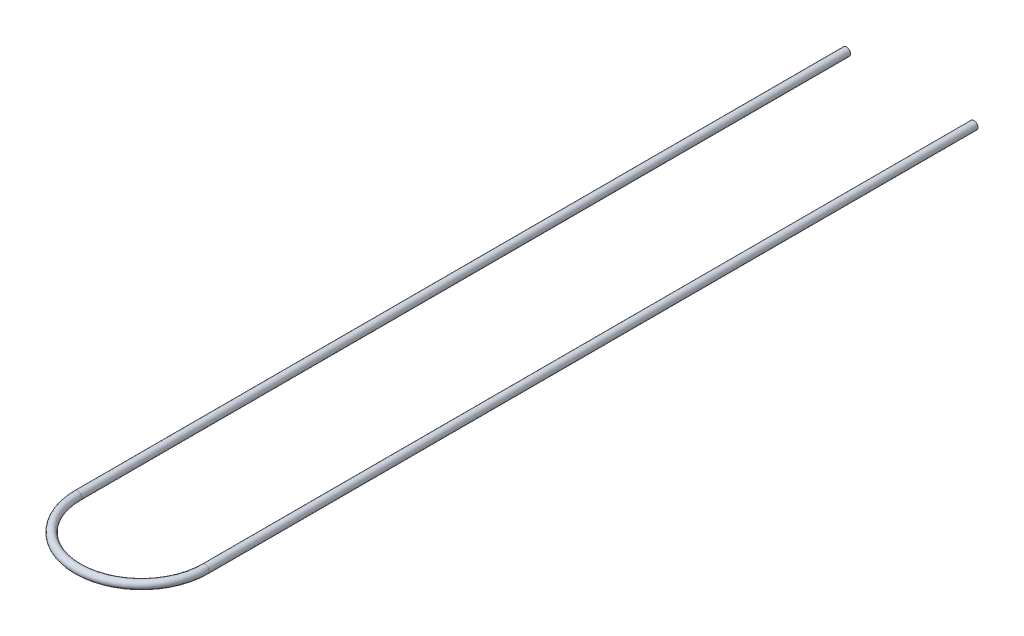
ISO-10303-21;
HEADER;
FILE_DESCRIPTION(('STEP AP214'),'2;1');
FILE_NAME('part.step','',(''),(''),'','','');
FILE_SCHEMA(('AUTOMOTIVE_DESIGN { 1 0 10303 214 1 1 1 1 }'));
ENDSEC;
DATA;
#1=APPLICATION_CONTEXT('core data for automotive mechanical design processes');
#2=APPLICATION_PROTOCOL_DEFINITION('international standard','automotive_design',2000,#1);
#3=PRODUCT_CONTEXT('',#1,'mechanical');
#4=PRODUCT('Part','Part','',(#3));
#5=PRODUCT_RELATED_PRODUCT_CATEGORY('part','',(#4));
#6=PRODUCT_DEFINITION_FORMATION('','',#4);
#7=PRODUCT_DEFINITION_CONTEXT('part definition',#1,'design');
#8=PRODUCT_DEFINITION('design','',#6,#7);
#9=PRODUCT_DEFINITION_SHAPE('','',#8);
#10=(LENGTH_UNIT() NAMED_UNIT(*) SI_UNIT(.MILLI.,.METRE.));
#11=(NAMED_UNIT(*) PLANE_ANGLE_UNIT() SI_UNIT($,.RADIAN.));
#12=(NAMED_UNIT(*) SI_UNIT($,.STERADIAN.) SOLID_ANGLE_UNIT());
#13=UNCERTAINTY_MEASURE_WITH_UNIT(LENGTH_MEASURE(1.E-05),#10,'distance_accuracy_value','');
#14=(GEOMETRIC_REPRESENTATION_CONTEXT(3) GLOBAL_UNCERTAINTY_ASSIGNED_CONTEXT((#13)) GLOBAL_UNIT_ASSIGNED_CONTEXT((#10,
#11,#12)) REPRESENTATION_CONTEXT('',''));
#15=CARTESIAN_POINT('',(0.,0.,0.));
#16=DIRECTION('',(0.,0.,1.));
#17=DIRECTION('',(1.,0.,0.));
#18=AXIS2_PLACEMENT_3D('',#15,#16,#17);
#19=CARTESIAN_POINT('',(-39.9999999999999,0.,299.999999999999));
#20=DIRECTION('',(0.,0.,1.));
#21=DIRECTION('',(1.,0.,0.));
#22=AXIS2_PLACEMENT_3D('',#19,#20,#21);
#23=CYLINDRICAL_SURFACE('',#22,11.1);
#24=CARTESIAN_POINT('',(-39.9999999999996,0.,2440.));
#25=DIRECTION('',(0.,0.,1.));
#26=DIRECTION('',(1.,0.,0.));
#27=AXIS2_PLACEMENT_3D('',#24,#25,#26);
#28=CIRCLE('',#27,11.1);
#29=CARTESIAN_POINT('',(-51.0999999999997,0.,2440.));
#30=VERTEX_POINT('',#29);
#31=EDGE_CURVE('E54',#30,#30,#28,.T.);
#32=ORIENTED_EDGE('',*,*,#31,.F.);
#33=EDGE_LOOP('',(#32));
#34=FACE_BOUND('',#33,.T.);
#35=CARTESIAN_POINT('',(-39.9999999999999,0.,299.999999999999));
#36=DIRECTION('',(0.,0.,1.));
#37=DIRECTION('',(1.,0.,0.));
#38=AXIS2_PLACEMENT_3D('',#35,#36,#37);
#39=CIRCLE('',#38,11.1);
#40=CARTESIAN_POINT('',(-28.8999999999999,0.,299.999999999999));
#41=VERTEX_POINT('',#40);
#42=EDGE_CURVE('E52',#41,#41,#39,.T.);
#43=ORIENTED_EDGE('',*,*,#42,.T.);
#44=EDGE_LOOP('',(#43));
#45=FACE_BOUND('',#44,.T.);
#46=ADVANCED_FACE('F31',(#34,#45),#23,.T.);
#47=CARTESIAN_POINT('',(137.385,0.,2440.));
#48=DIRECTION('',(0.,1.,0.));
#49=DIRECTION('',(0.,0.,1.));
#50=AXIS2_PLACEMENT_3D('',#47,#48,#49);
#51=TOROIDAL_SURFACE('',#50,177.385,11.1);
#52=CARTESIAN_POINT('',(314.77,0.,2440.));
#53=DIRECTION('',(0.,0.,-1.));
#54=DIRECTION('',(-1.,0.,0.));
#55=AXIS2_PLACEMENT_3D('',#52,#53,#54);
#56=CIRCLE('',#55,11.1);
#57=CARTESIAN_POINT('',(325.87,0.,2440.));
#58=VERTEX_POINT('',#57);
#59=EDGE_CURVE('E35',#58,#58,#56,.T.);
#60=CARTESIAN_POINT('',(137.385,0.,2440.));
#61=DIRECTION('',(0.,1.,0.));
#62=DIRECTION('',(0.,0.,1.));
#63=AXIS2_PLACEMENT_3D('',#60,#61,#62);
#64=CIRCLE('',#63,188.485);
#65=EDGE_CURVE('',#30,#58,#64,.T.);
#66=ORIENTED_EDGE('',*,*,#31,.T.);
#67=ORIENTED_EDGE('',*,*,#59,.F.);
#68=ORIENTED_EDGE('',*,*,#65,.T.);
#69=ORIENTED_EDGE('',*,*,#65,.F.);
#70=EDGE_LOOP('',(#66,#68,#67,#69));
#71=FACE_BOUND('',#70,.T.);
#72=ADVANCED_FACE('F62',(#71),#51,.T.);
#73=CARTESIAN_POINT('',(314.77,0.,2440.));
#74=DIRECTION('',(0.,0.,-1.));
#75=DIRECTION('',(-1.,0.,0.));
#76=AXIS2_PLACEMENT_3D('',#73,#74,#75);
#77=CYLINDRICAL_SURFACE('',#76,11.1);
#78=CARTESIAN_POINT('',(314.77,0.,299.999999999999));
#79=DIRECTION('',(0.,0.,-1.));
#80=DIRECTION('',(-1.,0.,0.));
#81=AXIS2_PLACEMENT_3D('',#78,#79,#80);
#82=CIRCLE('',#81,11.1);
#83=CARTESIAN_POINT('',(303.67,0.,299.999999999999));
#84=VERTEX_POINT('',#83);
#85=EDGE_CURVE('E48',#84,#84,#82,.T.);
#86=ORIENTED_EDGE('',*,*,#85,.F.);
#87=EDGE_LOOP('',(#86));
#88=FACE_BOUND('',#87,.T.);
#89=ORIENTED_EDGE('',*,*,#59,.T.);
#90=EDGE_LOOP('',(#89));
#91=FACE_BOUND('',#90,.T.);
#92=ADVANCED_FACE('F33',(#88,#91),#77,.T.);
#93=CARTESIAN_POINT('',(-39.9999999999999,0.,299.999999999999));
#94=DIRECTION('',(0.,0.,1.));
#95=DIRECTION('',(1.,0.,0.));
#96=AXIS2_PLACEMENT_3D('',#93,#94,#95);
#97=PLANE('',#96);
#98=CARTESIAN_POINT('',(-39.9999999999999,0.,299.999999999999));
#99=DIRECTION('',(0.,0.,1.));
#100=DIRECTION('',(1.,0.,0.));
#101=AXIS2_PLACEMENT_3D('',#98,#99,#100);
#102=CIRCLE('',#101,9.95000000000001);
#103=CARTESIAN_POINT('',(-30.0499999999999,0.,299.999999999999));
#104=VERTEX_POINT('',#103);
#105=EDGE_CURVE('E51',#104,#104,#102,.F.);
#106=ORIENTED_EDGE('',*,*,#105,.F.);
#107=EDGE_LOOP('',(#106));
#108=FACE_BOUND('',#107,.T.);
#109=ORIENTED_EDGE('',*,*,#42,.F.);
#110=EDGE_LOOP('',(#109));
#111=FACE_BOUND('',#110,.T.);
#112=ADVANCED_FACE('F68',(#108,#111),#97,.F.);
#113=CARTESIAN_POINT('',(314.77,0.,299.999999999999));
#114=DIRECTION('',(0.,0.,-1.));
#115=DIRECTION('',(-1.,0.,0.));
#116=AXIS2_PLACEMENT_3D('',#113,#114,#115);
#117=PLANE('',#116);
#118=CARTESIAN_POINT('',(314.77,0.,299.999999999999));
#119=DIRECTION('',(0.,0.,-1.));
#120=DIRECTION('',(-1.,0.,0.));
#121=AXIS2_PLACEMENT_3D('',#118,#119,#120);
#122=CIRCLE('',#121,9.95000000000001);
#123=CARTESIAN_POINT('',(304.82,0.,299.999999999999));
#124=VERTEX_POINT('',#123);
#125=EDGE_CURVE('E10',#124,#124,#122,.F.);
#126=ORIENTED_EDGE('',*,*,#125,.T.);
#127=EDGE_LOOP('',(#126));
#128=FACE_BOUND('',#127,.T.);
#129=ORIENTED_EDGE('',*,*,#85,.T.);
#130=EDGE_LOOP('',(#129));
#131=FACE_BOUND('',#130,.T.);
#132=ADVANCED_FACE('F86',(#128,#131),#117,.T.);
#133=CARTESIAN_POINT('',(-39.9999999999999,0.,299.999999999999));
#134=DIRECTION('',(0.,0.,1.));
#135=DIRECTION('',(1.,0.,0.));
#136=AXIS2_PLACEMENT_3D('',#133,#134,#135);
#137=CYLINDRICAL_SURFACE('',#136,9.95000000000001);
#138=CARTESIAN_POINT('',(-39.9999999999996,0.,2440.));
#139=DIRECTION('',(0.,0.,1.));
#140=DIRECTION('',(1.,0.,0.));
#141=AXIS2_PLACEMENT_3D('',#138,#139,#140);
#142=CIRCLE('',#141,9.95000000000001);
#143=CARTESIAN_POINT('',(-49.9499999999997,0.,2440.));
#144=VERTEX_POINT('',#143);
#145=EDGE_CURVE('E44',#144,#144,#142,.F.);
#146=ORIENTED_EDGE('',*,*,#145,.F.);
#147=EDGE_LOOP('',(#146));
#148=FACE_BOUND('',#147,.T.);
#149=ORIENTED_EDGE('',*,*,#105,.T.);
#150=EDGE_LOOP('',(#149));
#151=FACE_BOUND('',#150,.T.);
#152=ADVANCED_FACE('F80',(#148,#151),#137,.F.);
#153=CARTESIAN_POINT('',(137.385,0.,2440.));
#154=DIRECTION('',(0.,1.,0.));
#155=DIRECTION('',(0.,0.,1.));
#156=AXIS2_PLACEMENT_3D('',#153,#154,#155);
#157=TOROIDAL_SURFACE('',#156,177.385,9.95000000000001);
#158=CARTESIAN_POINT('',(314.77,0.,2440.));
#159=DIRECTION('',(0.,0.,-1.));
#160=DIRECTION('',(-1.,0.,0.));
#161=AXIS2_PLACEMENT_3D('',#158,#159,#160);
#162=CIRCLE('',#161,9.95000000000001);
#163=CARTESIAN_POINT('',(324.72,0.,2440.));
#164=VERTEX_POINT('',#163);
#165=EDGE_CURVE('E39',#164,#164,#162,.F.);
#166=CARTESIAN_POINT('',(137.385,0.,2440.));
#167=DIRECTION('',(0.,1.,0.));
#168=DIRECTION('',(0.,0.,1.));
#169=AXIS2_PLACEMENT_3D('',#166,#167,#168);
#170=CIRCLE('',#169,187.335);
#171=EDGE_CURVE('',#144,#164,#170,.T.);
#172=ORIENTED_EDGE('',*,*,#145,.T.);
#173=ORIENTED_EDGE('',*,*,#165,.F.);
#174=ORIENTED_EDGE('',*,*,#171,.T.);
#175=ORIENTED_EDGE('',*,*,#171,.F.);
#176=EDGE_LOOP('',(#172,#174,#173,#175));
#177=FACE_BOUND('',#176,.T.);
#178=ADVANCED_FACE('F74',(#177),#157,.F.);
#179=CARTESIAN_POINT('',(314.77,0.,2440.));
#180=DIRECTION('',(0.,0.,-1.));
#181=DIRECTION('',(-1.,0.,0.));
#182=AXIS2_PLACEMENT_3D('',#179,#180,#181);
#183=CYLINDRICAL_SURFACE('',#182,9.95000000000001);
#184=ORIENTED_EDGE('',*,*,#125,.F.);
#185=EDGE_LOOP('',(#184));
#186=FACE_BOUND('',#185,.T.);
#187=ORIENTED_EDGE('',*,*,#165,.T.);
#188=EDGE_LOOP('',(#187));
#189=FACE_BOUND('',#188,.T.);
#190=ADVANCED_FACE('F72',(#186,#189),#183,.F.);
#191=CLOSED_SHELL('',(#46,#72,#92,#112,#132,#152,#178,#190));
#192=MANIFOLD_SOLID_BREP('B2',#191);
#193=ADVANCED_BREP_SHAPE_REPRESENTATION('',(#18,#192),#14);
#194=SHAPE_DEFINITION_REPRESENTATION(#9,#193);
ENDSEC;
END-ISO-10303-21;
